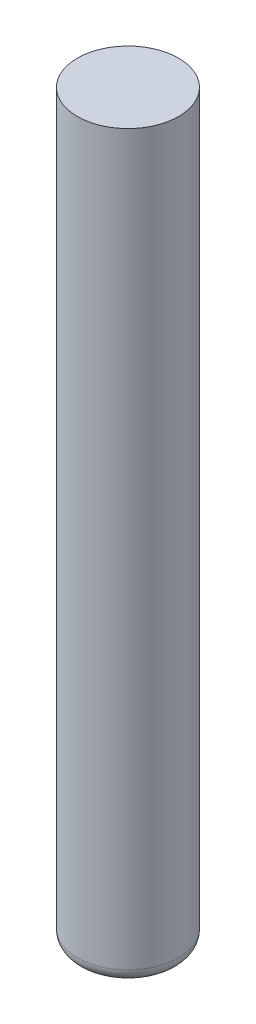
ISO-10303-21;
HEADER;
FILE_DESCRIPTION(('STEP AP214'),'2;1');
FILE_NAME('part.step','',(''),(''),'','','');
FILE_SCHEMA(('AUTOMOTIVE_DESIGN { 1 0 10303 214 1 1 1 1 }'));
ENDSEC;
DATA;
#1=APPLICATION_CONTEXT('core data for automotive mechanical design processes');
#2=APPLICATION_PROTOCOL_DEFINITION('international standard','automotive_design',2000,#1);
#3=PRODUCT_CONTEXT('',#1,'mechanical');
#4=PRODUCT('Part','Part','',(#3));
#5=PRODUCT_RELATED_PRODUCT_CATEGORY('part','',(#4));
#6=PRODUCT_DEFINITION_FORMATION('','',#4);
#7=PRODUCT_DEFINITION_CONTEXT('part definition',#1,'design');
#8=PRODUCT_DEFINITION('design','',#6,#7);
#9=PRODUCT_DEFINITION_SHAPE('','',#8);
#10=(LENGTH_UNIT() NAMED_UNIT(*) SI_UNIT(.MILLI.,.METRE.));
#11=(NAMED_UNIT(*) PLANE_ANGLE_UNIT() SI_UNIT($,.RADIAN.));
#12=(NAMED_UNIT(*) SI_UNIT($,.STERADIAN.) SOLID_ANGLE_UNIT());
#13=UNCERTAINTY_MEASURE_WITH_UNIT(LENGTH_MEASURE(1.E-05),#10,'distance_accuracy_value','');
#14=(GEOMETRIC_REPRESENTATION_CONTEXT(3) GLOBAL_UNCERTAINTY_ASSIGNED_CONTEXT((#13)) GLOBAL_UNIT_ASSIGNED_CONTEXT((#10,
#11,#12)) REPRESENTATION_CONTEXT('',''));
#15=CARTESIAN_POINT('',(0.,0.,0.));
#16=DIRECTION('',(0.,0.,1.));
#17=DIRECTION('',(1.,0.,0.));
#18=AXIS2_PLACEMENT_3D('',#15,#16,#17);
#19=CARTESIAN_POINT('',(0.,220.,0.));
#20=DIRECTION('',(0.,-1.,0.));
#21=DIRECTION('',(0.,0.,-1.));
#22=AXIS2_PLACEMENT_3D('',#19,#20,#21);
#23=CYLINDRICAL_SURFACE('',#22,15.);
#24=CARTESIAN_POINT('',(0.,4.,0.));
#25=DIRECTION('',(0.,1.,0.));
#26=DIRECTION('',(0.,0.,1.));
#27=AXIS2_PLACEMENT_3D('',#24,#25,#26);
#28=CIRCLE('',#27,15.);
#29=CARTESIAN_POINT('',(0.,4.,15.));
#30=VERTEX_POINT('',#29);
#31=EDGE_CURVE('E51',#30,#30,#28,.T.);
#32=ORIENTED_EDGE('',*,*,#31,.T.);
#33=EDGE_LOOP('',(#32));
#34=FACE_BOUND('',#33,.T.);
#35=CARTESIAN_POINT('',(0.,220.,0.));
#36=DIRECTION('',(0.,1.,0.));
#37=DIRECTION('',(0.,0.,1.));
#38=AXIS2_PLACEMENT_3D('',#35,#36,#37);
#39=CIRCLE('',#38,15.);
#40=CARTESIAN_POINT('',(0.,220.,15.));
#41=VERTEX_POINT('',#40);
#42=EDGE_CURVE('E56',#41,#41,#39,.T.);
#43=ORIENTED_EDGE('',*,*,#42,.F.);
#44=EDGE_LOOP('',(#43));
#45=FACE_BOUND('',#44,.T.);
#46=ADVANCED_FACE('F43',(#34,#45),#23,.T.);
#47=CARTESIAN_POINT('',(0.,220.,0.));
#48=DIRECTION('',(0.,1.,0.));
#49=DIRECTION('',(0.,0.,1.));
#50=AXIS2_PLACEMENT_3D('',#47,#48,#49);
#51=PLANE('',#50);
#52=ORIENTED_EDGE('',*,*,#42,.T.);
#53=EDGE_LOOP('',(#52));
#54=FACE_BOUND('',#53,.T.);
#55=ADVANCED_FACE('F64',(#54),#51,.T.);
#56=CARTESIAN_POINT('',(0.,0.,0.));
#57=DIRECTION('',(0.,1.,0.));
#58=DIRECTION('',(0.,0.,1.));
#59=AXIS2_PLACEMENT_3D('',#56,#57,#58);
#60=PLANE('',#59);
#61=CARTESIAN_POINT('',(0.,0.,0.));
#62=DIRECTION('',(0.,1.,0.));
#63=DIRECTION('',(0.,0.,1.));
#64=AXIS2_PLACEMENT_3D('',#61,#62,#63);
#65=CIRCLE('',#64,11.);
#66=CARTESIAN_POINT('',(0.,0.,11.));
#67=VERTEX_POINT('',#66);
#68=EDGE_CURVE('E10',#67,#67,#65,.F.);
#69=ORIENTED_EDGE('',*,*,#68,.T.);
#70=EDGE_LOOP('',(#69));
#71=FACE_BOUND('',#70,.T.);
#72=ADVANCED_FACE('F71',(#71),#60,.F.);
#73=CARTESIAN_POINT('',(0.,4.,0.));
#74=DIRECTION('',(0.,1.,0.));
#75=DIRECTION('',(0.,0.,1.));
#76=AXIS2_PLACEMENT_3D('',#73,#74,#75);
#77=TOROIDAL_SURFACE('',#76,11.,4.);
#78=ORIENTED_EDGE('',*,*,#68,.F.);
#79=EDGE_LOOP('',(#78));
#80=FACE_BOUND('',#79,.T.);
#81=ORIENTED_EDGE('',*,*,#31,.F.);
#82=EDGE_LOOP('',(#81));
#83=FACE_BOUND('',#82,.T.);
#84=ADVANCED_FACE('F45',(#80,#83),#77,.T.);
#85=CLOSED_SHELL('',(#46,#55,#72,#84));
#86=MANIFOLD_SOLID_BREP('B2',#85);
#87=ADVANCED_BREP_SHAPE_REPRESENTATION('',(#18,#86),#14);
#88=SHAPE_DEFINITION_REPRESENTATION(#9,#87);
ENDSEC;
END-ISO-10303-21;
